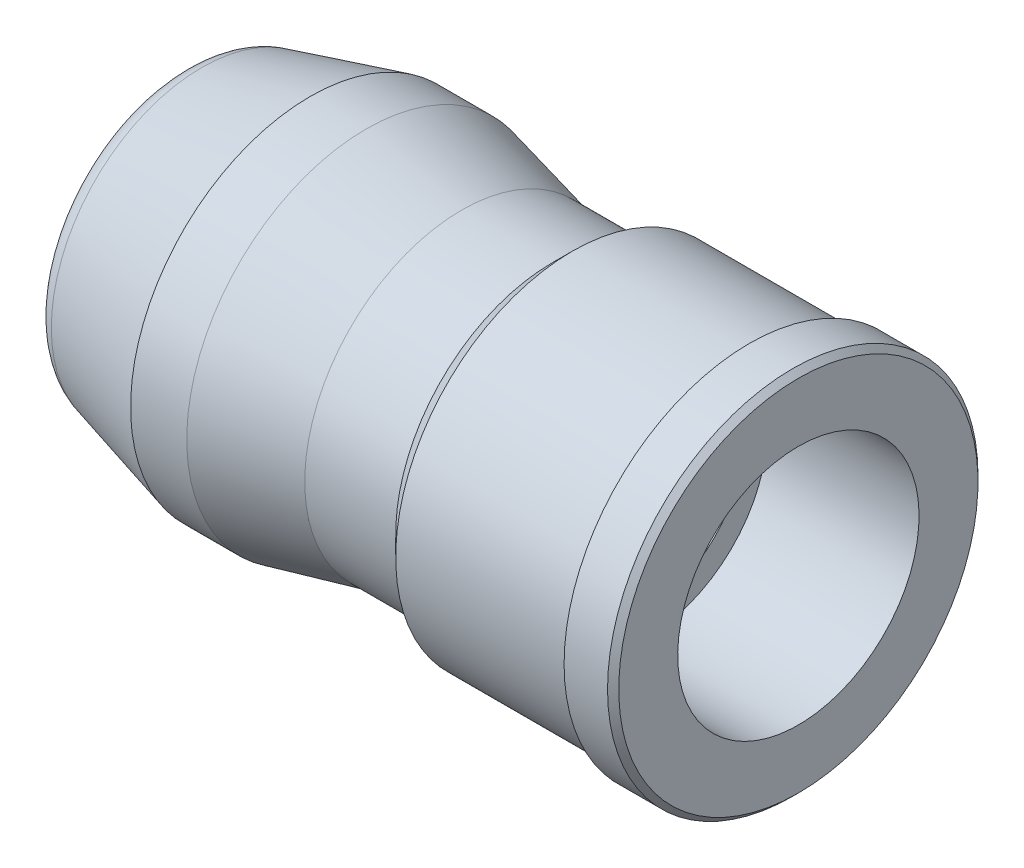
ISO-10303-21;
HEADER;
FILE_DESCRIPTION(('STEP AP214'),'2;1');
FILE_NAME('part.step','',(''),(''),'','','');
FILE_SCHEMA(('AUTOMOTIVE_DESIGN { 1 0 10303 214 1 1 1 1 }'));
ENDSEC;
DATA;
#1=APPLICATION_CONTEXT('core data for automotive mechanical design processes');
#2=APPLICATION_PROTOCOL_DEFINITION('international standard','automotive_design',2000,#1);
#3=PRODUCT_CONTEXT('',#1,'mechanical');
#4=PRODUCT('Part','Part','',(#3));
#5=PRODUCT_RELATED_PRODUCT_CATEGORY('part','',(#4));
#6=PRODUCT_DEFINITION_FORMATION('','',#4);
#7=PRODUCT_DEFINITION_CONTEXT('part definition',#1,'design');
#8=PRODUCT_DEFINITION('design','',#6,#7);
#9=PRODUCT_DEFINITION_SHAPE('','',#8);
#10=(LENGTH_UNIT() NAMED_UNIT(*) SI_UNIT(.MILLI.,.METRE.));
#11=(NAMED_UNIT(*) PLANE_ANGLE_UNIT() SI_UNIT($,.RADIAN.));
#12=(NAMED_UNIT(*) SI_UNIT($,.STERADIAN.) SOLID_ANGLE_UNIT());
#13=UNCERTAINTY_MEASURE_WITH_UNIT(LENGTH_MEASURE(1.E-05),#10,'distance_accuracy_value','');
#14=(GEOMETRIC_REPRESENTATION_CONTEXT(3) GLOBAL_UNCERTAINTY_ASSIGNED_CONTEXT((#13)) GLOBAL_UNIT_ASSIGNED_CONTEXT((#10,
#11,#12)) REPRESENTATION_CONTEXT('',''));
#15=CARTESIAN_POINT('',(0.,0.,0.));
#16=DIRECTION('',(0.,0.,1.));
#17=DIRECTION('',(1.,0.,0.));
#18=AXIS2_PLACEMENT_3D('',#15,#16,#17);
#19=CARTESIAN_POINT('',(10.,0.,0.));
#20=DIRECTION('',(-1.,0.,0.));
#21=DIRECTION('',(0.,-1.,0.));
#22=AXIS2_PLACEMENT_3D('',#19,#20,#21);
#23=CYLINDRICAL_SURFACE('',#22,1.70679434089389);
#24=CARTESIAN_POINT('',(8.3,0.,0.));
#25=DIRECTION('',(1.,0.,0.));
#26=DIRECTION('',(0.,1.,0.));
#27=AXIS2_PLACEMENT_3D('',#24,#25,#26);
#28=CIRCLE('',#27,1.70679434089389);
#29=CARTESIAN_POINT('',(8.3,1.70679434089389,0.));
#30=VERTEX_POINT('',#29);
#31=EDGE_CURVE('E66',#30,#30,#28,.T.);
#32=ORIENTED_EDGE('',*,*,#31,.T.);
#33=EDGE_LOOP('',(#32));
#34=FACE_BOUND('',#33,.T.);
#35=CARTESIAN_POINT('',(0.5,0.,0.));
#36=DIRECTION('',(-1.,0.,0.));
#37=DIRECTION('',(0.,-1.,0.));
#38=AXIS2_PLACEMENT_3D('',#35,#36,#37);
#39=CIRCLE('',#38,1.70679434089389);
#40=CARTESIAN_POINT('',(0.5,-1.70679434089389,0.));
#41=VERTEX_POINT('',#40);
#42=EDGE_CURVE('E63',#41,#41,#39,.F.);
#43=ORIENTED_EDGE('',*,*,#42,.F.);
#44=EDGE_LOOP('',(#43));
#45=FACE_BOUND('',#44,.T.);
#46=ADVANCED_FACE('F35',(#34,#45),#23,.F.);
#47=CARTESIAN_POINT('',(0.,0.,0.));
#48=DIRECTION('',(-1.,0.,0.));
#49=DIRECTION('',(0.,-1.,0.));
#50=AXIS2_PLACEMENT_3D('',#47,#48,#49);
#51=PLANE('',#50);
#52=CARTESIAN_POINT('',(0.,0.,0.));
#53=DIRECTION('',(-1.,0.,0.));
#54=DIRECTION('',(0.,-1.,0.));
#55=AXIS2_PLACEMENT_3D('',#52,#53,#54);
#56=CIRCLE('',#55,2.19633650601052);
#57=CARTESIAN_POINT('',(0.,-2.19633650601052,0.));
#58=VERTEX_POINT('',#57);
#59=EDGE_CURVE('E56',#58,#58,#56,.T.);
#60=ORIENTED_EDGE('',*,*,#59,.T.);
#61=EDGE_LOOP('',(#60));
#62=FACE_BOUND('',#61,.T.);
#63=CARTESIAN_POINT('',(0.,0.,0.));
#64=DIRECTION('',(-1.,0.,0.));
#65=DIRECTION('',(0.,-1.,0.));
#66=AXIS2_PLACEMENT_3D('',#63,#64,#65);
#67=CIRCLE('',#66,2.05020378226105);
#68=CARTESIAN_POINT('',(0.,-2.05020378226105,0.));
#69=VERTEX_POINT('',#68);
#70=EDGE_CURVE('E93',#69,#69,#67,.T.);
#71=ORIENTED_EDGE('',*,*,#70,.F.);
#72=EDGE_LOOP('',(#71));
#73=FACE_BOUND('',#72,.T.);
#74=ADVANCED_FACE('F109',(#62,#73),#51,.T.);
#75=CARTESIAN_POINT('',(2.3,0.,0.));
#76=DIRECTION('',(1.,0.,0.));
#77=DIRECTION('',(0.,1.,0.));
#78=AXIS2_PLACEMENT_3D('',#75,#76,#77);
#79=CONICAL_SURFACE('',#78,3.19628314259158,0.261799387799146);
#80=CARTESIAN_POINT('',(0.370590477448743,0.,0.));
#81=DIRECTION('',(-1.,0.,0.));
#82=DIRECTION('',(0.,-1.,0.));
#83=AXIS2_PLACEMENT_3D('',#80,#81,#82);
#84=CIRCLE('',#83,2.67929941915505);
#85=CARTESIAN_POINT('',(0.370590477448743,-2.67929941915505,0.));
#86=VERTEX_POINT('',#85);
#87=EDGE_CURVE('E59',#86,#86,#84,.F.);
#88=ORIENTED_EDGE('',*,*,#87,.T.);
#89=EDGE_LOOP('',(#88));
#90=FACE_BOUND('',#89,.T.);
#91=CARTESIAN_POINT('',(2.3,0.,0.));
#92=DIRECTION('',(1.,0.,0.));
#93=DIRECTION('',(0.,1.,0.));
#94=AXIS2_PLACEMENT_3D('',#91,#92,#93);
#95=CIRCLE('',#94,3.19628314259158);
#96=CARTESIAN_POINT('',(2.3,3.19628314259158,0.));
#97=VERTEX_POINT('',#96);
#98=EDGE_CURVE('E62',#97,#97,#95,.T.);
#99=ORIENTED_EDGE('',*,*,#98,.F.);
#100=EDGE_LOOP('',(#99));
#101=FACE_BOUND('',#100,.T.);
#102=ADVANCED_FACE('F111',(#90,#101),#79,.T.);
#103=CARTESIAN_POINT('',(8.3,0.,0.));
#104=DIRECTION('',(1.,0.,0.));
#105=DIRECTION('',(0.,1.,0.));
#106=AXIS2_PLACEMENT_3D('',#103,#104,#105);
#107=CYLINDRICAL_SURFACE('',#106,3.19628314259158);
#108=ORIENTED_EDGE('',*,*,#98,.T.);
#109=EDGE_LOOP('',(#108));
#110=FACE_BOUND('',#109,.T.);
#111=CARTESIAN_POINT('',(3.3,0.,0.));
#112=DIRECTION('',(1.,0.,0.));
#113=DIRECTION('',(0.,1.,0.));
#114=AXIS2_PLACEMENT_3D('',#111,#112,#113);
#115=CIRCLE('',#114,3.19628314259157);
#116=CARTESIAN_POINT('',(3.3,3.19628314259157,0.));
#117=VERTEX_POINT('',#116);
#118=EDGE_CURVE('E73',#117,#117,#115,.T.);
#119=ORIENTED_EDGE('',*,*,#118,.F.);
#120=EDGE_LOOP('',(#119));
#121=FACE_BOUND('',#120,.T.);
#122=ADVANCED_FACE('F118',(#110,#121),#107,.T.);
#123=CARTESIAN_POINT('',(5.,0.,0.));
#124=DIRECTION('',(-1.,0.,0.));
#125=DIRECTION('',(0.,-1.,0.));
#126=AXIS2_PLACEMENT_3D('',#123,#124,#125);
#127=CONICAL_SURFACE('',#126,2.79386812367069,0.232436316304168);
#128=ORIENTED_EDGE('',*,*,#118,.T.);
#129=EDGE_LOOP('',(#128));
#130=FACE_BOUND('',#129,.T.);
#131=CARTESIAN_POINT('',(5.,0.,0.));
#132=DIRECTION('',(1.,0.,0.));
#133=DIRECTION('',(0.,1.,0.));
#134=AXIS2_PLACEMENT_3D('',#131,#132,#133);
#135=CIRCLE('',#134,2.79386812367069);
#136=CARTESIAN_POINT('',(5.,2.79386812367069,0.));
#137=VERTEX_POINT('',#136);
#138=EDGE_CURVE('E76',#137,#137,#135,.T.);
#139=ORIENTED_EDGE('',*,*,#138,.F.);
#140=EDGE_LOOP('',(#139));
#141=FACE_BOUND('',#140,.T.);
#142=ADVANCED_FACE('F180',(#130,#141),#127,.T.);
#143=CARTESIAN_POINT('',(8.3,0.,0.));
#144=DIRECTION('',(1.,0.,0.));
#145=DIRECTION('',(0.,1.,0.));
#146=AXIS2_PLACEMENT_3D('',#143,#144,#145);
#147=CYLINDRICAL_SURFACE('',#146,2.79386812367069);
#148=ORIENTED_EDGE('',*,*,#138,.T.);
#149=EDGE_LOOP('',(#148));
#150=FACE_BOUND('',#149,.T.);
#151=CARTESIAN_POINT('',(6.62,0.,0.));
#152=DIRECTION('',(1.,0.,0.));
#153=DIRECTION('',(0.,1.,0.));
#154=AXIS2_PLACEMENT_3D('',#151,#152,#153);
#155=CIRCLE('',#154,2.79386812367069);
#156=CARTESIAN_POINT('',(6.62,2.79386812367069,0.));
#157=VERTEX_POINT('',#156);
#158=EDGE_CURVE('E79',#157,#157,#155,.T.);
#159=ORIENTED_EDGE('',*,*,#158,.F.);
#160=EDGE_LOOP('',(#159));
#161=FACE_BOUND('',#160,.T.);
#162=ADVANCED_FACE('F176',(#150,#161),#147,.T.);
#163=CARTESIAN_POINT('',(6.97613187632931,0.,0.));
#164=DIRECTION('',(1.,0.,0.));
#165=DIRECTION('',(0.,1.,0.));
#166=AXIS2_PLACEMENT_3D('',#163,#164,#165);
#167=CONICAL_SURFACE('',#166,3.15,0.785398163397451);
#168=ORIENTED_EDGE('',*,*,#158,.T.);
#169=EDGE_LOOP('',(#168));
#170=FACE_BOUND('',#169,.T.);
#171=CARTESIAN_POINT('',(6.97613187632931,0.,0.));
#172=DIRECTION('',(1.,0.,0.));
#173=DIRECTION('',(0.,1.,0.));
#174=AXIS2_PLACEMENT_3D('',#171,#172,#173);
#175=CIRCLE('',#174,3.15);
#176=CARTESIAN_POINT('',(6.97613187632931,3.15,0.));
#177=VERTEX_POINT('',#176);
#178=EDGE_CURVE('E82',#177,#177,#175,.T.);
#179=ORIENTED_EDGE('',*,*,#178,.F.);
#180=EDGE_LOOP('',(#179));
#181=FACE_BOUND('',#180,.T.);
#182=ADVANCED_FACE('F173',(#170,#181),#167,.T.);
#183=CARTESIAN_POINT('',(8.3,0.,0.));
#184=DIRECTION('',(1.,0.,0.));
#185=DIRECTION('',(0.,1.,0.));
#186=AXIS2_PLACEMENT_3D('',#183,#184,#185);
#187=CYLINDRICAL_SURFACE('',#186,3.15);
#188=CARTESIAN_POINT('',(10.0261318763293,0.,0.));
#189=DIRECTION('',(-1.,0.,0.));
#190=DIRECTION('',(0.,-1.,0.));
#191=AXIS2_PLACEMENT_3D('',#188,#189,#190);
#192=CIRCLE('',#191,3.15);
#193=CARTESIAN_POINT('',(10.0261318763293,-3.15,0.));
#194=VERTEX_POINT('',#193);
#195=EDGE_CURVE('E10',#194,#194,#192,.T.);
#196=ORIENTED_EDGE('',*,*,#195,.T.);
#197=EDGE_LOOP('',(#196));
#198=FACE_BOUND('',#197,.T.);
#199=ORIENTED_EDGE('',*,*,#178,.T.);
#200=EDGE_LOOP('',(#199));
#201=FACE_BOUND('',#200,.T.);
#202=ADVANCED_FACE('F170',(#198,#201),#187,.T.);
#203=CARTESIAN_POINT('',(10.1261318763293,3.15,0.));
#204=DIRECTION('',(-1.,0.,0.));
#205=DIRECTION('',(0.,-1.,0.));
#206=AXIS2_PLACEMENT_3D('',#203,#204,#205);
#207=PLANE('',#206);
#208=CARTESIAN_POINT('',(10.1261318763293,0.,0.));
#209=DIRECTION('',(-1.,0.,0.));
#210=DIRECTION('',(0.,-1.,0.));
#211=AXIS2_PLACEMENT_3D('',#208,#209,#210);
#212=CIRCLE('',#211,3.25);
#213=CARTESIAN_POINT('',(10.1261318763293,-3.25,0.));
#214=VERTEX_POINT('',#213);
#215=EDGE_CURVE('E43',#214,#214,#212,.F.);
#216=ORIENTED_EDGE('',*,*,#215,.T.);
#217=EDGE_LOOP('',(#216));
#218=FACE_BOUND('',#217,.T.);
#219=CARTESIAN_POINT('',(10.1261318763293,0.,0.));
#220=DIRECTION('',(1.,0.,0.));
#221=DIRECTION('',(0.,1.,0.));
#222=AXIS2_PLACEMENT_3D('',#219,#220,#221);
#223=CIRCLE('',#222,3.3);
#224=CARTESIAN_POINT('',(10.1261318763293,3.3,0.));
#225=VERTEX_POINT('',#224);
#226=EDGE_CURVE('E85',#225,#225,#223,.T.);
#227=ORIENTED_EDGE('',*,*,#226,.F.);
#228=EDGE_LOOP('',(#227));
#229=FACE_BOUND('',#228,.T.);
#230=ADVANCED_FACE('F166',(#218,#229),#207,.T.);
#231=CARTESIAN_POINT('',(8.3,0.,0.));
#232=DIRECTION('',(1.,0.,0.));
#233=DIRECTION('',(0.,1.,0.));
#234=AXIS2_PLACEMENT_3D('',#231,#232,#233);
#235=CYLINDRICAL_SURFACE('',#234,3.3);
#236=CARTESIAN_POINT('',(10.9,0.,0.));
#237=DIRECTION('',(1.,0.,0.));
#238=DIRECTION('',(0.,1.,0.));
#239=AXIS2_PLACEMENT_3D('',#236,#237,#238);
#240=CIRCLE('',#239,3.3);
#241=CARTESIAN_POINT('',(10.9,3.3,0.));
#242=VERTEX_POINT('',#241);
#243=EDGE_CURVE('E47',#242,#242,#240,.F.);
#244=ORIENTED_EDGE('',*,*,#243,.T.);
#245=EDGE_LOOP('',(#244));
#246=FACE_BOUND('',#245,.T.);
#247=ORIENTED_EDGE('',*,*,#226,.T.);
#248=EDGE_LOOP('',(#247));
#249=FACE_BOUND('',#248,.T.);
#250=ADVANCED_FACE('F145',(#246,#249),#235,.T.);
#251=CARTESIAN_POINT('',(11.,3.3,0.));
#252=DIRECTION('',(1.,0.,0.));
#253=DIRECTION('',(0.,1.,0.));
#254=AXIS2_PLACEMENT_3D('',#251,#252,#253);
#255=PLANE('',#254);
#256=CARTESIAN_POINT('',(11.,0.,0.));
#257=DIRECTION('',(1.,0.,0.));
#258=DIRECTION('',(0.,1.,0.));
#259=AXIS2_PLACEMENT_3D('',#256,#257,#258);
#260=CIRCLE('',#259,3.2);
#261=CARTESIAN_POINT('',(11.,3.2,0.));
#262=VERTEX_POINT('',#261);
#263=EDGE_CURVE('E51',#262,#262,#260,.T.);
#264=ORIENTED_EDGE('',*,*,#263,.T.);
#265=EDGE_LOOP('',(#264));
#266=FACE_BOUND('',#265,.T.);
#267=CARTESIAN_POINT('',(11.,0.,0.));
#268=DIRECTION('',(1.,0.,0.));
#269=DIRECTION('',(0.,1.,0.));
#270=AXIS2_PLACEMENT_3D('',#267,#268,#269);
#271=CIRCLE('',#270,2.15);
#272=CARTESIAN_POINT('',(11.,2.15,0.));
#273=VERTEX_POINT('',#272);
#274=EDGE_CURVE('E88',#273,#273,#271,.T.);
#275=ORIENTED_EDGE('',*,*,#274,.F.);
#276=EDGE_LOOP('',(#275));
#277=FACE_BOUND('',#276,.T.);
#278=ADVANCED_FACE('F141',(#266,#277),#255,.T.);
#279=CARTESIAN_POINT('',(8.3,0.,0.));
#280=DIRECTION('',(1.,0.,0.));
#281=DIRECTION('',(0.,1.,0.));
#282=AXIS2_PLACEMENT_3D('',#279,#280,#281);
#283=CYLINDRICAL_SURFACE('',#282,2.15);
#284=ORIENTED_EDGE('',*,*,#274,.T.);
#285=EDGE_LOOP('',(#284));
#286=FACE_BOUND('',#285,.T.);
#287=CARTESIAN_POINT('',(8.3,0.,0.));
#288=DIRECTION('',(1.,0.,0.));
#289=DIRECTION('',(0.,1.,0.));
#290=AXIS2_PLACEMENT_3D('',#287,#288,#289);
#291=CIRCLE('',#290,2.15);
#292=CARTESIAN_POINT('',(8.3,2.15,0.));
#293=VERTEX_POINT('',#292);
#294=EDGE_CURVE('E70',#293,#293,#291,.T.);
#295=ORIENTED_EDGE('',*,*,#294,.F.);
#296=EDGE_LOOP('',(#295));
#297=FACE_BOUND('',#296,.T.);
#298=ADVANCED_FACE('F144',(#286,#297),#283,.F.);
#299=CARTESIAN_POINT('',(8.3,2.15,0.));
#300=DIRECTION('',(1.,0.,0.));
#301=DIRECTION('',(0.,1.,0.));
#302=AXIS2_PLACEMENT_3D('',#299,#300,#301);
#303=PLANE('',#302);
#304=ORIENTED_EDGE('',*,*,#31,.F.);
#305=EDGE_LOOP('',(#304));
#306=FACE_BOUND('',#305,.T.);
#307=ORIENTED_EDGE('',*,*,#294,.T.);
#308=EDGE_LOOP('',(#307));
#309=FACE_BOUND('',#308,.T.);
#310=ADVANCED_FACE('F151',(#306,#309),#303,.T.);
#311=CARTESIAN_POINT('',(0.5,0.,0.));
#312=DIRECTION('',(-1.,0.,0.));
#313=DIRECTION('',(0.,-1.,0.));
#314=AXIS2_PLACEMENT_3D('',#311,#312,#313);
#315=PLANE('',#314);
#316=CARTESIAN_POINT('',(0.5,0.,0.));
#317=DIRECTION('',(-1.,0.,0.));
#318=DIRECTION('',(0.,-1.,0.));
#319=AXIS2_PLACEMENT_3D('',#316,#317,#318);
#320=CIRCLE('',#319,2.05020378226105);
#321=CARTESIAN_POINT('',(0.5,-2.05020378226105,0.));
#322=VERTEX_POINT('',#321);
#323=EDGE_CURVE('E67',#322,#322,#320,.T.);
#324=ORIENTED_EDGE('',*,*,#323,.T.);
#325=EDGE_LOOP('',(#324));
#326=FACE_BOUND('',#325,.T.);
#327=ORIENTED_EDGE('',*,*,#42,.T.);
#328=EDGE_LOOP('',(#327));
#329=FACE_BOUND('',#328,.T.);
#330=ADVANCED_FACE('F99',(#326,#329),#315,.T.);
#331=CARTESIAN_POINT('',(0.5,0.,0.));
#332=DIRECTION('',(-1.,0.,0.));
#333=DIRECTION('',(0.,-1.,0.));
#334=AXIS2_PLACEMENT_3D('',#331,#332,#333);
#335=CYLINDRICAL_SURFACE('',#334,2.05020378226105);
#336=ORIENTED_EDGE('',*,*,#323,.F.);
#337=EDGE_LOOP('',(#336));
#338=FACE_BOUND('',#337,.T.);
#339=ORIENTED_EDGE('',*,*,#70,.T.);
#340=EDGE_LOOP('',(#339));
#341=FACE_BOUND('',#340,.T.);
#342=ADVANCED_FACE('F102',(#338,#341),#335,.F.);
#343=CARTESIAN_POINT('',(0.5,0.,0.));
#344=DIRECTION('',(-1.,0.,0.));
#345=DIRECTION('',(0.,-1.,0.));
#346=AXIS2_PLACEMENT_3D('',#343,#344,#345);
#347=TOROIDAL_SURFACE('',#346,2.19633650601052,0.5);
#348=ORIENTED_EDGE('',*,*,#59,.F.);
#349=EDGE_LOOP('',(#348));
#350=FACE_BOUND('',#349,.T.);
#351=ORIENTED_EDGE('',*,*,#87,.F.);
#352=EDGE_LOOP('',(#351));
#353=FACE_BOUND('',#352,.T.);
#354=ADVANCED_FACE('F105',(#350,#353),#347,.T.);
#355=CARTESIAN_POINT('',(11.,0.,0.));
#356=DIRECTION('',(-1.,0.,0.));
#357=DIRECTION('',(0.,-1.,0.));
#358=AXIS2_PLACEMENT_3D('',#355,#356,#357);
#359=CONICAL_SURFACE('',#358,3.2,0.785398163397446);
#360=ORIENTED_EDGE('',*,*,#243,.F.);
#361=EDGE_LOOP('',(#360));
#362=FACE_BOUND('',#361,.T.);
#363=ORIENTED_EDGE('',*,*,#263,.F.);
#364=EDGE_LOOP('',(#363));
#365=FACE_BOUND('',#364,.T.);
#366=ADVANCED_FACE('F126',(#362,#365),#359,.T.);
#367=CARTESIAN_POINT('',(10.1261318763293,0.,0.));
#368=DIRECTION('',(1.,0.,0.));
#369=DIRECTION('',(0.,1.,0.));
#370=AXIS2_PLACEMENT_3D('',#367,#368,#369);
#371=CONICAL_SURFACE('',#370,3.25,0.785398163397459);
#372=ORIENTED_EDGE('',*,*,#195,.F.);
#373=EDGE_LOOP('',(#372));
#374=FACE_BOUND('',#373,.T.);
#375=ORIENTED_EDGE('',*,*,#215,.F.);
#376=EDGE_LOOP('',(#375));
#377=FACE_BOUND('',#376,.T.);
#378=ADVANCED_FACE('F38',(#374,#377),#371,.T.);
#379=CLOSED_SHELL('',(#46,#74,#102,#122,#142,#162,#182,#202,#230,#250,#278,#298,#310,#330,#342,
#354,#366,#378));
#380=MANIFOLD_SOLID_BREP('B2',#379);
#381=ADVANCED_BREP_SHAPE_REPRESENTATION('',(#18,#380),#14);
#382=SHAPE_DEFINITION_REPRESENTATION(#9,#381);
ENDSEC;
END-ISO-10303-21;
